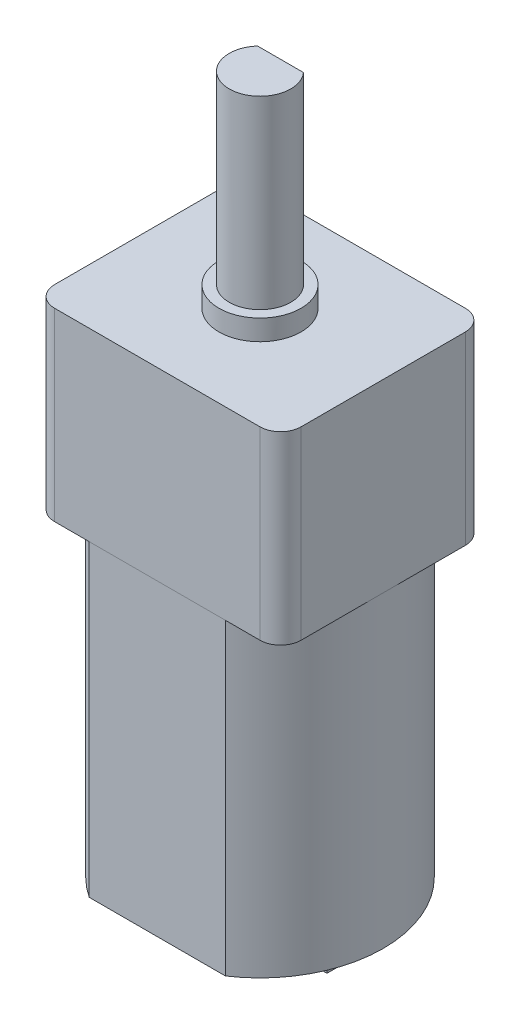
ISO-10303-21;
HEADER;
FILE_DESCRIPTION(('STEP AP214'),'2;1');
FILE_NAME('part.step','',(''),(''),'','','');
FILE_SCHEMA(('AUTOMOTIVE_DESIGN { 1 0 10303 214 1 1 1 1 }'));
ENDSEC;
DATA;
#1=APPLICATION_CONTEXT('core data for automotive mechanical design processes');
#2=APPLICATION_PROTOCOL_DEFINITION('international standard','automotive_design',2000,#1);
#3=PRODUCT_CONTEXT('',#1,'mechanical');
#4=PRODUCT('Part','Part','',(#3));
#5=PRODUCT_RELATED_PRODUCT_CATEGORY('part','',(#4));
#6=PRODUCT_DEFINITION_FORMATION('','',#4);
#7=PRODUCT_DEFINITION_CONTEXT('part definition',#1,'design');
#8=PRODUCT_DEFINITION('design','',#6,#7);
#9=PRODUCT_DEFINITION_SHAPE('','',#8);
#10=(LENGTH_UNIT() NAMED_UNIT(*) SI_UNIT(.MILLI.,.METRE.));
#11=(NAMED_UNIT(*) PLANE_ANGLE_UNIT() SI_UNIT($,.RADIAN.));
#12=(NAMED_UNIT(*) SI_UNIT($,.STERADIAN.) SOLID_ANGLE_UNIT());
#13=UNCERTAINTY_MEASURE_WITH_UNIT(LENGTH_MEASURE(1.E-05),#10,'distance_accuracy_value','');
#14=(GEOMETRIC_REPRESENTATION_CONTEXT(3) GLOBAL_UNCERTAINTY_ASSIGNED_CONTEXT((#13)) GLOBAL_UNIT_ASSIGNED_CONTEXT((#10,
#11,#12)) REPRESENTATION_CONTEXT('',''));
#15=CARTESIAN_POINT('',(0.,0.,0.));
#16=DIRECTION('',(0.,0.,1.));
#17=DIRECTION('',(1.,0.,0.));
#18=AXIS2_PLACEMENT_3D('',#15,#16,#17);
#19=CARTESIAN_POINT('',(0.,25.,0.));
#20=DIRECTION('',(0.,1.,0.));
#21=DIRECTION('',(0.,0.,1.));
#22=AXIS2_PLACEMENT_3D('',#19,#20,#21);
#23=PLANE('',#22);
#24=CARTESIAN_POINT('',(0.,25.,0.));
#25=DIRECTION('',(0.,1.,0.));
#26=DIRECTION('',(0.,0.,1.));
#27=AXIS2_PLACEMENT_3D('',#24,#25,#26);
#28=CIRCLE('',#27,2.);
#29=CARTESIAN_POINT('',(0.,25.,2.));
#30=VERTEX_POINT('',#29);
#31=EDGE_CURVE('E161',#30,#30,#28,.T.);
#32=ORIENTED_EDGE('',*,*,#31,.T.);
#33=EDGE_LOOP('',(#32));
#34=FACE_BOUND('',#33,.T.);
#35=CARTESIAN_POINT('',(0.,25.,0.));
#36=DIRECTION('',(0.,1.,0.));
#37=DIRECTION('',(0.,0.,1.));
#38=AXIS2_PLACEMENT_3D('',#35,#36,#37);
#39=CIRCLE('',#38,1.5);
#40=CARTESIAN_POINT('',(0.,25.,1.5));
#41=VERTEX_POINT('',#40);
#42=EDGE_CURVE('E49',#41,#41,#39,.F.);
#43=ORIENTED_EDGE('',*,*,#42,.T.);
#44=EDGE_LOOP('',(#43));
#45=FACE_BOUND('',#44,.T.);
#46=ADVANCED_FACE('F45',(#34,#45),#23,.T.);
#47=CARTESIAN_POINT('',(-5.,24.,4.));
#48=DIRECTION('',(0.,-1.,0.));
#49=DIRECTION('',(0.,0.,-1.));
#50=AXIS2_PLACEMENT_3D('',#47,#48,#49);
#51=PLANE('',#50);
#52=CARTESIAN_POINT('',(-5.,24.,4.));
#53=DIRECTION('',(0.,1.,0.));
#54=DIRECTION('',(0.,0.,-1.));
#55=AXIS2_PLACEMENT_3D('',#52,#53,#54);
#56=CIRCLE('',#55,1.);
#57=CARTESIAN_POINT('',(-6.,24.,3.99999999999999));
#58=VERTEX_POINT('',#57);
#59=CARTESIAN_POINT('',(-4.99999999999999,24.,5.));
#60=VERTEX_POINT('',#59);
#61=EDGE_CURVE('E173',#58,#60,#56,.T.);
#62=ORIENTED_EDGE('',*,*,#61,.T.);
#63=DIRECTION('',(1.,0.,0.));
#64=VECTOR('',#63,1.);
#65=CARTESIAN_POINT('',(4.99999999999999,24.,5.));
#66=LINE('',#65,#64);
#67=CARTESIAN_POINT('',(4.99999999999999,24.,5.));
#68=VERTEX_POINT('',#67);
#69=EDGE_CURVE('E112',#60,#68,#66,.T.);
#70=ORIENTED_EDGE('',*,*,#69,.T.);
#71=CARTESIAN_POINT('',(5.,24.,4.));
#72=DIRECTION('',(0.,1.,0.));
#73=DIRECTION('',(0.,0.,-1.));
#74=AXIS2_PLACEMENT_3D('',#71,#72,#73);
#75=CIRCLE('',#74,1.);
#76=CARTESIAN_POINT('',(6.,24.,3.99999999999999));
#77=VERTEX_POINT('',#76);
#78=EDGE_CURVE('E205',#68,#77,#75,.T.);
#79=ORIENTED_EDGE('',*,*,#78,.T.);
#80=DIRECTION('',(0.,0.,-1.));
#81=VECTOR('',#80,1.);
#82=CARTESIAN_POINT('',(6.,24.,-3.99999999999999));
#83=LINE('',#82,#81);
#84=CARTESIAN_POINT('',(6.,24.,-3.99999999999999));
#85=VERTEX_POINT('',#84);
#86=EDGE_CURVE('E204',#77,#85,#83,.T.);
#87=ORIENTED_EDGE('',*,*,#86,.T.);
#88=CARTESIAN_POINT('',(5.,24.,-4.));
#89=DIRECTION('',(0.,1.,0.));
#90=DIRECTION('',(0.,0.,-1.));
#91=AXIS2_PLACEMENT_3D('',#88,#89,#90);
#92=CIRCLE('',#91,1.);
#93=CARTESIAN_POINT('',(4.99999999999999,24.,-5.));
#94=VERTEX_POINT('',#93);
#95=EDGE_CURVE('E136',#85,#94,#92,.T.);
#96=ORIENTED_EDGE('',*,*,#95,.T.);
#97=DIRECTION('',(-1.,0.,0.));
#98=VECTOR('',#97,1.);
#99=CARTESIAN_POINT('',(4.99999999999999,24.,-5.));
#100=LINE('',#99,#98);
#101=CARTESIAN_POINT('',(-4.99999999999999,24.,-5.));
#102=VERTEX_POINT('',#101);
#103=EDGE_CURVE('E128',#94,#102,#100,.T.);
#104=ORIENTED_EDGE('',*,*,#103,.T.);
#105=CARTESIAN_POINT('',(-5.,24.,-4.));
#106=DIRECTION('',(0.,1.,0.));
#107=DIRECTION('',(0.,0.,-1.));
#108=AXIS2_PLACEMENT_3D('',#105,#106,#107);
#109=CIRCLE('',#108,1.);
#110=CARTESIAN_POINT('',(-6.,24.,-3.99999999999999));
#111=VERTEX_POINT('',#110);
#112=EDGE_CURVE('E133',#102,#111,#109,.T.);
#113=ORIENTED_EDGE('',*,*,#112,.T.);
#114=DIRECTION('',(0.,0.,1.));
#115=VECTOR('',#114,1.);
#116=CARTESIAN_POINT('',(-6.,24.,-3.99999999999999));
#117=LINE('',#116,#115);
#118=EDGE_CURVE('E70',#111,#58,#117,.T.);
#119=ORIENTED_EDGE('',*,*,#118,.T.);
#120=EDGE_LOOP('',(#62,#70,#79,#87,#96,#104,#113,#119));
#121=FACE_BOUND('',#120,.T.);
#122=CARTESIAN_POINT('',(0.,24.,0.));
#123=DIRECTION('',(0.,-1.,0.));
#124=DIRECTION('',(0.,0.,-1.));
#125=AXIS2_PLACEMENT_3D('',#122,#123,#124);
#126=CIRCLE('',#125,2.);
#127=CARTESIAN_POINT('',(0.,24.,-2.));
#128=VERTEX_POINT('',#127);
#129=EDGE_CURVE('E12',#128,#128,#126,.F.);
#130=ORIENTED_EDGE('',*,*,#129,.F.);
#131=EDGE_LOOP('',(#130));
#132=FACE_BOUND('',#131,.T.);
#133=ADVANCED_FACE('F130',(#121,#132),#51,.F.);
#134=CARTESIAN_POINT('',(-5.,24.,4.));
#135=DIRECTION('',(0.,-1.,0.));
#136=DIRECTION('',(0.,0.,-1.));
#137=AXIS2_PLACEMENT_3D('',#134,#135,#136);
#138=CYLINDRICAL_SURFACE('',#137,1.);
#139=CARTESIAN_POINT('',(-5.,15.,4.));
#140=DIRECTION('',(0.,1.,0.));
#141=DIRECTION('',(0.,0.,-1.));
#142=AXIS2_PLACEMENT_3D('',#139,#140,#141);
#143=CIRCLE('',#142,1.);
#144=CARTESIAN_POINT('',(-6.,15.,3.99999999999999));
#145=VERTEX_POINT('',#144);
#146=CARTESIAN_POINT('',(-4.99999999999999,15.,5.));
#147=VERTEX_POINT('',#146);
#148=EDGE_CURVE('E157',#145,#147,#143,.T.);
#149=ORIENTED_EDGE('',*,*,#148,.T.);
#150=DIRECTION('',(0.,-1.,0.));
#151=VECTOR('',#150,1.);
#152=CARTESIAN_POINT('',(-4.99999999999999,24.,5.));
#153=LINE('',#152,#151);
#154=EDGE_CURVE('E54',#60,#147,#153,.T.);
#155=ORIENTED_EDGE('',*,*,#154,.F.);
#156=ORIENTED_EDGE('',*,*,#61,.F.);
#157=DIRECTION('',(0.,-1.,0.));
#158=VECTOR('',#157,1.);
#159=CARTESIAN_POINT('',(-6.,24.,3.99999999999999));
#160=LINE('',#159,#158);
#161=EDGE_CURVE('E153',#58,#145,#160,.T.);
#162=ORIENTED_EDGE('',*,*,#161,.T.);
#163=EDGE_LOOP('',(#149,#155,#156,#162));
#164=FACE_BOUND('',#163,.T.);
#165=ADVANCED_FACE('F47',(#164),#138,.T.);
#166=CARTESIAN_POINT('',(4.99999999999999,24.,5.));
#167=DIRECTION('',(0.,0.,-1.));
#168=DIRECTION('',(-1.,0.,0.));
#169=AXIS2_PLACEMENT_3D('',#166,#167,#168);
#170=PLANE('',#169);
#171=DIRECTION('',(1.,0.,0.));
#172=VECTOR('',#171,1.);
#173=CARTESIAN_POINT('',(4.99999999999999,15.,5.));
#174=LINE('',#173,#172);
#175=CARTESIAN_POINT('',(4.99999999999999,15.,5.));
#176=VERTEX_POINT('',#175);
#177=EDGE_CURVE('E160',#147,#176,#174,.T.);
#178=ORIENTED_EDGE('',*,*,#177,.T.);
#179=DIRECTION('',(0.,-1.,0.));
#180=VECTOR('',#179,1.);
#181=CARTESIAN_POINT('',(4.99999999999999,24.,5.));
#182=LINE('',#181,#180);
#183=EDGE_CURVE('E183',#68,#176,#182,.T.);
#184=ORIENTED_EDGE('',*,*,#183,.F.);
#185=ORIENTED_EDGE('',*,*,#69,.F.);
#186=ORIENTED_EDGE('',*,*,#154,.T.);
#187=EDGE_LOOP('',(#178,#184,#185,#186));
#188=FACE_BOUND('',#187,.T.);
#189=ADVANCED_FACE('F187',(#188),#170,.F.);
#190=CARTESIAN_POINT('',(5.,24.,4.));
#191=DIRECTION('',(0.,-1.,0.));
#192=DIRECTION('',(0.,0.,-1.));
#193=AXIS2_PLACEMENT_3D('',#190,#191,#192);
#194=CYLINDRICAL_SURFACE('',#193,1.);
#195=CARTESIAN_POINT('',(5.,15.,4.));
#196=DIRECTION('',(0.,1.,0.));
#197=DIRECTION('',(0.,0.,-1.));
#198=AXIS2_PLACEMENT_3D('',#195,#196,#197);
#199=CIRCLE('',#198,1.);
#200=CARTESIAN_POINT('',(6.,15.,3.99999999999999));
#201=VERTEX_POINT('',#200);
#202=EDGE_CURVE('E163',#176,#201,#199,.T.);
#203=ORIENTED_EDGE('',*,*,#202,.T.);
#204=DIRECTION('',(0.,-1.,0.));
#205=VECTOR('',#204,1.);
#206=CARTESIAN_POINT('',(6.,24.,3.99999999999999));
#207=LINE('',#206,#205);
#208=EDGE_CURVE('E180',#77,#201,#207,.T.);
#209=ORIENTED_EDGE('',*,*,#208,.F.);
#210=ORIENTED_EDGE('',*,*,#78,.F.);
#211=ORIENTED_EDGE('',*,*,#183,.T.);
#212=EDGE_LOOP('',(#203,#209,#210,#211));
#213=FACE_BOUND('',#212,.T.);
#214=ADVANCED_FACE('F198',(#213),#194,.T.);
#215=CARTESIAN_POINT('',(6.,24.,-3.99999999999999));
#216=DIRECTION('',(-1.,0.,0.));
#217=DIRECTION('',(0.,0.,1.));
#218=AXIS2_PLACEMENT_3D('',#215,#216,#217);
#219=PLANE('',#218);
#220=DIRECTION('',(0.,0.,-1.));
#221=VECTOR('',#220,1.);
#222=CARTESIAN_POINT('',(6.,15.,-3.99999999999999));
#223=LINE('',#222,#221);
#224=CARTESIAN_POINT('',(6.,15.,-3.99999999999999));
#225=VERTEX_POINT('',#224);
#226=EDGE_CURVE('E165',#201,#225,#223,.T.);
#227=ORIENTED_EDGE('',*,*,#226,.T.);
#228=DIRECTION('',(0.,-1.,0.));
#229=VECTOR('',#228,1.);
#230=CARTESIAN_POINT('',(6.,24.,-3.99999999999999));
#231=LINE('',#230,#229);
#232=EDGE_CURVE('E177',#85,#225,#231,.T.);
#233=ORIENTED_EDGE('',*,*,#232,.F.);
#234=ORIENTED_EDGE('',*,*,#86,.F.);
#235=ORIENTED_EDGE('',*,*,#208,.T.);
#236=EDGE_LOOP('',(#227,#233,#234,#235));
#237=FACE_BOUND('',#236,.T.);
#238=ADVANCED_FACE('F202',(#237),#219,.F.);
#239=CARTESIAN_POINT('',(5.,24.,-4.));
#240=DIRECTION('',(0.,-1.,0.));
#241=DIRECTION('',(0.,0.,-1.));
#242=AXIS2_PLACEMENT_3D('',#239,#240,#241);
#243=CYLINDRICAL_SURFACE('',#242,1.);
#244=CARTESIAN_POINT('',(5.,15.,-4.));
#245=DIRECTION('',(0.,1.,0.));
#246=DIRECTION('',(0.,0.,-1.));
#247=AXIS2_PLACEMENT_3D('',#244,#245,#246);
#248=CIRCLE('',#247,1.);
#249=CARTESIAN_POINT('',(4.99999999999999,15.,-5.));
#250=VERTEX_POINT('',#249);
#251=EDGE_CURVE('E167',#225,#250,#248,.T.);
#252=ORIENTED_EDGE('',*,*,#251,.T.);
#253=DIRECTION('',(0.,-1.,0.));
#254=VECTOR('',#253,1.);
#255=CARTESIAN_POINT('',(4.99999999999999,24.,-5.));
#256=LINE('',#255,#254);
#257=EDGE_CURVE('E148',#94,#250,#256,.T.);
#258=ORIENTED_EDGE('',*,*,#257,.F.);
#259=ORIENTED_EDGE('',*,*,#95,.F.);
#260=ORIENTED_EDGE('',*,*,#232,.T.);
#261=EDGE_LOOP('',(#252,#258,#259,#260));
#262=FACE_BOUND('',#261,.T.);
#263=ADVANCED_FACE('F270',(#262),#243,.T.);
#264=CARTESIAN_POINT('',(4.99999999999999,24.,-5.));
#265=DIRECTION('',(0.,0.,1.));
#266=DIRECTION('',(1.,0.,0.));
#267=AXIS2_PLACEMENT_3D('',#264,#265,#266);
#268=PLANE('',#267);
#269=DIRECTION('',(-1.,0.,0.));
#270=VECTOR('',#269,1.);
#271=CARTESIAN_POINT('',(4.99999999999999,15.,-5.));
#272=LINE('',#271,#270);
#273=CARTESIAN_POINT('',(-4.99999999999999,15.,-5.));
#274=VERTEX_POINT('',#273);
#275=EDGE_CURVE('E145',#250,#274,#272,.T.);
#276=ORIENTED_EDGE('',*,*,#275,.T.);
#277=DIRECTION('',(0.,-1.,0.));
#278=VECTOR('',#277,1.);
#279=CARTESIAN_POINT('',(-4.99999999999999,24.,-5.));
#280=LINE('',#279,#278);
#281=EDGE_CURVE('E142',#102,#274,#280,.T.);
#282=ORIENTED_EDGE('',*,*,#281,.F.);
#283=ORIENTED_EDGE('',*,*,#103,.F.);
#284=ORIENTED_EDGE('',*,*,#257,.T.);
#285=EDGE_LOOP('',(#276,#282,#283,#284));
#286=FACE_BOUND('',#285,.T.);
#287=ADVANCED_FACE('F143',(#286),#268,.F.);
#288=CARTESIAN_POINT('',(-5.,24.,-4.));
#289=DIRECTION('',(0.,-1.,0.));
#290=DIRECTION('',(0.,0.,-1.));
#291=AXIS2_PLACEMENT_3D('',#288,#289,#290);
#292=CYLINDRICAL_SURFACE('',#291,1.);
#293=CARTESIAN_POINT('',(-5.,15.,-4.));
#294=DIRECTION('',(0.,1.,0.));
#295=DIRECTION('',(0.,0.,-1.));
#296=AXIS2_PLACEMENT_3D('',#293,#294,#295);
#297=CIRCLE('',#296,1.);
#298=CARTESIAN_POINT('',(-6.,15.,-3.99999999999999));
#299=VERTEX_POINT('',#298);
#300=EDGE_CURVE('E170',#274,#299,#297,.T.);
#301=ORIENTED_EDGE('',*,*,#300,.T.);
#302=DIRECTION('',(0.,-1.,0.));
#303=VECTOR('',#302,1.);
#304=CARTESIAN_POINT('',(-6.,24.,-3.99999999999999));
#305=LINE('',#304,#303);
#306=EDGE_CURVE('E149',#111,#299,#305,.T.);
#307=ORIENTED_EDGE('',*,*,#306,.F.);
#308=ORIENTED_EDGE('',*,*,#112,.F.);
#309=ORIENTED_EDGE('',*,*,#281,.T.);
#310=EDGE_LOOP('',(#301,#307,#308,#309));
#311=FACE_BOUND('',#310,.T.);
#312=ADVANCED_FACE('F151',(#311),#292,.T.);
#313=CARTESIAN_POINT('',(-6.,24.,-3.99999999999999));
#314=DIRECTION('',(1.,0.,0.));
#315=DIRECTION('',(0.,0.,-1.));
#316=AXIS2_PLACEMENT_3D('',#313,#314,#315);
#317=PLANE('',#316);
#318=DIRECTION('',(0.,0.,1.));
#319=VECTOR('',#318,1.);
#320=CARTESIAN_POINT('',(-6.,15.,-3.99999999999999));
#321=LINE('',#320,#319);
#322=EDGE_CURVE('E103',#299,#145,#321,.T.);
#323=ORIENTED_EDGE('',*,*,#322,.T.);
#324=ORIENTED_EDGE('',*,*,#161,.F.);
#325=ORIENTED_EDGE('',*,*,#118,.F.);
#326=ORIENTED_EDGE('',*,*,#306,.T.);
#327=EDGE_LOOP('',(#323,#324,#325,#326));
#328=FACE_BOUND('',#327,.T.);
#329=ADVANCED_FACE('F263',(#328),#317,.F.);
#330=CARTESIAN_POINT('',(-5.,15.,4.));
#331=DIRECTION('',(0.,-1.,0.));
#332=DIRECTION('',(0.,0.,-1.));
#333=AXIS2_PLACEMENT_3D('',#330,#331,#332);
#334=PLANE('',#333);
#335=ORIENTED_EDGE('',*,*,#148,.F.);
#336=ORIENTED_EDGE('',*,*,#322,.F.);
#337=ORIENTED_EDGE('',*,*,#300,.F.);
#338=ORIENTED_EDGE('',*,*,#275,.F.);
#339=ORIENTED_EDGE('',*,*,#251,.F.);
#340=ORIENTED_EDGE('',*,*,#226,.F.);
#341=ORIENTED_EDGE('',*,*,#202,.F.);
#342=ORIENTED_EDGE('',*,*,#177,.F.);
#343=EDGE_LOOP('',(#335,#336,#337,#338,#339,#340,#341,#342));
#344=FACE_BOUND('',#343,.T.);
#345=ADVANCED_FACE('F192',(#344),#334,.T.);
#346=CARTESIAN_POINT('',(0.,25.,0.));
#347=DIRECTION('',(0.,-1.,0.));
#348=DIRECTION('',(0.,0.,-1.));
#349=AXIS2_PLACEMENT_3D('',#346,#347,#348);
#350=CYLINDRICAL_SURFACE('',#349,2.);
#351=ORIENTED_EDGE('',*,*,#31,.F.);
#352=EDGE_LOOP('',(#351));
#353=FACE_BOUND('',#352,.T.);
#354=ORIENTED_EDGE('',*,*,#129,.T.);
#355=EDGE_LOOP('',(#354));
#356=FACE_BOUND('',#355,.T.);
#357=ADVANCED_FACE('F247',(#353,#356),#350,.T.);
#358=CARTESIAN_POINT('',(0.,34.,0.));
#359=DIRECTION('',(0.,-1.,0.));
#360=DIRECTION('',(0.,0.,-1.));
#361=AXIS2_PLACEMENT_3D('',#358,#359,#360);
#362=CYLINDRICAL_SURFACE('',#361,1.5);
#363=CARTESIAN_POINT('',(0.,34.,0.));
#364=DIRECTION('',(0.,1.,0.));
#365=DIRECTION('',(0.,0.,1.));
#366=AXIS2_PLACEMENT_3D('',#363,#364,#365);
#367=CIRCLE('',#366,1.5);
#368=CARTESIAN_POINT('',(-1.1180339887499,34.,-1.));
#369=VERTEX_POINT('',#368);
#370=CARTESIAN_POINT('',(1.1180339887499,34.,-1.));
#371=VERTEX_POINT('',#370);
#372=EDGE_CURVE('E213',#369,#371,#367,.T.);
#373=ORIENTED_EDGE('',*,*,#372,.F.);
#374=DIRECTION('',(0.,1.,0.));
#375=VECTOR('',#374,1.);
#376=CARTESIAN_POINT('',(-1.1180339887499,25.5,-1.));
#377=LINE('',#376,#375);
#378=CARTESIAN_POINT('',(-1.1180339887499,25.5,-1.));
#379=VERTEX_POINT('',#378);
#380=EDGE_CURVE('E61',#379,#369,#377,.T.);
#381=ORIENTED_EDGE('',*,*,#380,.F.);
#382=CARTESIAN_POINT('',(0.,25.5,0.));
#383=DIRECTION('',(0.,1.,0.));
#384=DIRECTION('',(0.,0.,-1.));
#385=AXIS2_PLACEMENT_3D('',#382,#383,#384);
#386=CIRCLE('',#385,1.5);
#387=CARTESIAN_POINT('',(1.1180339887499,25.5,-1.));
#388=VERTEX_POINT('',#387);
#389=EDGE_CURVE('E223',#388,#379,#386,.T.);
#390=ORIENTED_EDGE('',*,*,#389,.F.);
#391=DIRECTION('',(0.,1.,0.));
#392=VECTOR('',#391,1.);
#393=CARTESIAN_POINT('',(1.1180339887499,25.5,-1.));
#394=LINE('',#393,#392);
#395=EDGE_CURVE('E216',#388,#371,#394,.T.);
#396=ORIENTED_EDGE('',*,*,#395,.T.);
#397=EDGE_LOOP('',(#373,#381,#390,#396));
#398=FACE_BOUND('',#397,.T.);
#399=ORIENTED_EDGE('',*,*,#42,.F.);
#400=EDGE_LOOP('',(#399));
#401=FACE_BOUND('',#400,.T.);
#402=ADVANCED_FACE('F236',(#398,#401),#362,.T.);
#403=CARTESIAN_POINT('',(0.,34.,0.));
#404=DIRECTION('',(0.,1.,0.));
#405=DIRECTION('',(0.,0.,1.));
#406=AXIS2_PLACEMENT_3D('',#403,#404,#405);
#407=PLANE('',#406);
#408=DIRECTION('',(1.,0.,0.));
#409=VECTOR('',#408,1.);
#410=CARTESIAN_POINT('',(-1.1180339887499,34.,-1.));
#411=LINE('',#410,#409);
#412=EDGE_CURVE('E221',#369,#371,#411,.T.);
#413=ORIENTED_EDGE('',*,*,#412,.F.);
#414=ORIENTED_EDGE('',*,*,#372,.T.);
#415=EDGE_LOOP('',(#413,#414));
#416=FACE_BOUND('',#415,.T.);
#417=ADVANCED_FACE('F239',(#416),#407,.T.);
#418=CARTESIAN_POINT('',(-1.1180339887499,25.5,-1.));
#419=DIRECTION('',(0.,0.,1.));
#420=DIRECTION('',(1.,0.,0.));
#421=AXIS2_PLACEMENT_3D('',#418,#419,#420);
#422=PLANE('',#421);
#423=ORIENTED_EDGE('',*,*,#412,.T.);
#424=ORIENTED_EDGE('',*,*,#395,.F.);
#425=DIRECTION('',(1.,0.,0.));
#426=VECTOR('',#425,1.);
#427=CARTESIAN_POINT('',(-1.1180339887499,25.5,-1.));
#428=LINE('',#427,#426);
#429=EDGE_CURVE('E218',#379,#388,#428,.T.);
#430=ORIENTED_EDGE('',*,*,#429,.F.);
#431=ORIENTED_EDGE('',*,*,#380,.T.);
#432=EDGE_LOOP('',(#423,#424,#430,#431));
#433=FACE_BOUND('',#432,.T.);
#434=ADVANCED_FACE('F234',(#433),#422,.F.);
#435=CARTESIAN_POINT('',(0.,25.5,0.));
#436=DIRECTION('',(0.,-1.,0.));
#437=DIRECTION('',(0.,0.,-1.));
#438=AXIS2_PLACEMENT_3D('',#435,#436,#437);
#439=PLANE('',#438);
#440=ORIENTED_EDGE('',*,*,#389,.T.);
#441=ORIENTED_EDGE('',*,*,#429,.T.);
#442=EDGE_LOOP('',(#440,#441));
#443=FACE_BOUND('',#442,.T.);
#444=ADVANCED_FACE('F230',(#443),#439,.F.);
#445=CLOSED_SHELL('',(#46,#133,#165,#189,#214,#238,#263,#287,#312,#329,#345,#357,#402,#417,#434,#444));
#446=MANIFOLD_SOLID_BREP('B2',#445);
#447=CARTESIAN_POINT('',(0.,0.,0.));
#448=DIRECTION('',(0.,1.,0.));
#449=DIRECTION('',(0.,0.,1.));
#450=AXIS2_PLACEMENT_3D('',#447,#448,#449);
#451=PLANE('',#450);
#452=DIRECTION('',(0.,0.,1.));
#453=VECTOR('',#452,1.);
#454=CARTESIAN_POINT('',(-3.98773543561631,0.,0.915406021028156));
#455=LINE('',#454,#453);
#456=CARTESIAN_POINT('',(-3.98773543561631,0.,-0.915406021028156));
#457=VERTEX_POINT('',#456);
#458=CARTESIAN_POINT('',(-3.98773543561631,0.,0.915406021028156));
#459=VERTEX_POINT('',#458);
#460=EDGE_CURVE('E491',#457,#459,#455,.T.);
#461=ORIENTED_EDGE('',*,*,#460,.F.);
#462=DIRECTION('',(1.,0.,0.));
#463=VECTOR('',#462,1.);
#464=CARTESIAN_POINT('',(-4.17698389695304,0.,-0.915406021028156));
#465=LINE('',#464,#463);
#466=CARTESIAN_POINT('',(-4.17698389695304,0.,-0.915406021028156));
#467=VERTEX_POINT('',#466);
#468=EDGE_CURVE('E504',#467,#457,#465,.T.);
#469=ORIENTED_EDGE('',*,*,#468,.F.);
#470=DIRECTION('',(0.,0.,-1.));
#471=VECTOR('',#470,1.);
#472=CARTESIAN_POINT('',(-4.17698389695304,0.,0.915406021028156));
#473=LINE('',#472,#471);
#474=CARTESIAN_POINT('',(-4.17698389695304,0.,0.915406021028156));
#475=VERTEX_POINT('',#474);
#476=EDGE_CURVE('E513',#475,#467,#473,.T.);
#477=ORIENTED_EDGE('',*,*,#476,.F.);
#478=DIRECTION('',(-1.,0.,0.));
#479=VECTOR('',#478,1.);
#480=CARTESIAN_POINT('',(-4.17698389695304,0.,0.915406021028156));
#481=LINE('',#480,#479);
#482=EDGE_CURVE('E494',#459,#475,#481,.T.);
#483=ORIENTED_EDGE('',*,*,#482,.F.);
#484=EDGE_LOOP('',(#461,#469,#477,#483));
#485=FACE_BOUND('',#484,.T.);
#486=CARTESIAN_POINT('',(0.,0.,0.));
#487=DIRECTION('',(0.,1.,0.));
#488=DIRECTION('',(0.,0.,1.));
#489=AXIS2_PLACEMENT_3D('',#486,#487,#488);
#490=CIRCLE('',#489,6.);
#491=CARTESIAN_POINT('',(3.3166247903554,0.,5.));
#492=VERTEX_POINT('',#491);
#493=CARTESIAN_POINT('',(3.3166247903554,0.,-5.));
#494=VERTEX_POINT('',#493);
#495=EDGE_CURVE('E532',#492,#494,#490,.T.);
#496=ORIENTED_EDGE('',*,*,#495,.F.);
#497=DIRECTION('',(1.,0.,0.));
#498=VECTOR('',#497,1.);
#499=CARTESIAN_POINT('',(-3.3166247903554,0.,5.));
#500=LINE('',#499,#498);
#501=CARTESIAN_POINT('',(-3.3166247903554,0.,5.));
#502=VERTEX_POINT('',#501);
#503=EDGE_CURVE('E537',#502,#492,#500,.T.);
#504=ORIENTED_EDGE('',*,*,#503,.F.);
#505=CARTESIAN_POINT('',(0.,0.,0.));
#506=DIRECTION('',(0.,1.,0.));
#507=DIRECTION('',(0.,0.,1.));
#508=AXIS2_PLACEMENT_3D('',#505,#506,#507);
#509=CIRCLE('',#508,6.);
#510=CARTESIAN_POINT('',(-3.3166247903554,0.,-5.));
#511=VERTEX_POINT('',#510);
#512=EDGE_CURVE('E548',#511,#502,#509,.T.);
#513=ORIENTED_EDGE('',*,*,#512,.F.);
#514=DIRECTION('',(-1.,0.,0.));
#515=VECTOR('',#514,1.);
#516=CARTESIAN_POINT('',(-3.3166247903554,0.,-5.));
#517=LINE('',#516,#515);
#518=EDGE_CURVE('E546',#494,#511,#517,.T.);
#519=ORIENTED_EDGE('',*,*,#518,.F.);
#520=EDGE_LOOP('',(#496,#504,#513,#519));
#521=FACE_BOUND('',#520,.T.);
#522=CARTESIAN_POINT('',(0.,0.,0.));
#523=DIRECTION('',(0.,1.,0.));
#524=DIRECTION('',(0.,0.,1.));
#525=AXIS2_PLACEMENT_3D('',#522,#523,#524);
#526=CIRCLE('',#525,2.5);
#527=CARTESIAN_POINT('',(0.,0.,2.5));
#528=VERTEX_POINT('',#527);
#529=EDGE_CURVE('E43',#528,#528,#526,.F.);
#530=ORIENTED_EDGE('',*,*,#529,.F.);
#531=EDGE_LOOP('',(#530));
#532=FACE_BOUND('',#531,.T.);
#533=DIRECTION('',(0.,0.,1.));
#534=VECTOR('',#533,1.);
#535=CARTESIAN_POINT('',(4.17698389695304,0.,0.915406021028156));
#536=LINE('',#535,#534);
#537=CARTESIAN_POINT('',(4.17698389695304,0.,-0.915406021028156));
#538=VERTEX_POINT('',#537);
#539=CARTESIAN_POINT('',(4.17698389695304,0.,0.915406021028156));
#540=VERTEX_POINT('',#539);
#541=EDGE_CURVE('E490',#538,#540,#536,.T.);
#542=ORIENTED_EDGE('',*,*,#541,.F.);
#543=DIRECTION('',(1.,0.,0.));
#544=VECTOR('',#543,1.);
#545=CARTESIAN_POINT('',(4.17698389695304,0.,-0.915406021028156));
#546=LINE('',#545,#544);
#547=CARTESIAN_POINT('',(3.98773543561631,0.,-0.915406021028156));
#548=VERTEX_POINT('',#547);
#549=EDGE_CURVE('E487',#548,#538,#546,.T.);
#550=ORIENTED_EDGE('',*,*,#549,.F.);
#551=DIRECTION('',(0.,0.,-1.));
#552=VECTOR('',#551,1.);
#553=CARTESIAN_POINT('',(3.98773543561631,0.,0.915406021028156));
#554=LINE('',#553,#552);
#555=CARTESIAN_POINT('',(3.98773543561631,0.,0.915406021028156));
#556=VERTEX_POINT('',#555);
#557=EDGE_CURVE('E401',#556,#548,#554,.T.);
#558=ORIENTED_EDGE('',*,*,#557,.F.);
#559=DIRECTION('',(-1.,0.,0.));
#560=VECTOR('',#559,1.);
#561=CARTESIAN_POINT('',(4.17698389695304,0.,0.915406021028156));
#562=LINE('',#561,#560);
#563=EDGE_CURVE('E396',#540,#556,#562,.T.);
#564=ORIENTED_EDGE('',*,*,#563,.F.);
#565=EDGE_LOOP('',(#542,#550,#558,#564));
#566=FACE_BOUND('',#565,.T.);
#567=ADVANCED_FACE('F381',(#485,#521,#532,#566),#451,.F.);
#568=CARTESIAN_POINT('',(0.,15.,0.));
#569=DIRECTION('',(0.,-1.,0.));
#570=DIRECTION('',(0.,0.,-1.));
#571=AXIS2_PLACEMENT_3D('',#568,#569,#570);
#572=CYLINDRICAL_SURFACE('',#571,6.);
#573=ORIENTED_EDGE('',*,*,#495,.T.);
#574=DIRECTION('',(0.,-1.,0.));
#575=VECTOR('',#574,1.);
#576=CARTESIAN_POINT('',(3.3166247903554,15.,-5.));
#577=LINE('',#576,#575);
#578=CARTESIAN_POINT('',(3.3166247903554,15.,-5.));
#579=VERTEX_POINT('',#578);
#580=EDGE_CURVE('E389',#579,#494,#577,.T.);
#581=ORIENTED_EDGE('',*,*,#580,.F.);
#582=CARTESIAN_POINT('',(0.,15.,0.));
#583=DIRECTION('',(0.,1.,0.));
#584=DIRECTION('',(0.,0.,1.));
#585=AXIS2_PLACEMENT_3D('',#582,#583,#584);
#586=CIRCLE('',#585,6.);
#587=CARTESIAN_POINT('',(3.3166247903554,15.,5.));
#588=VERTEX_POINT('',#587);
#589=EDGE_CURVE('E533',#588,#579,#586,.T.);
#590=ORIENTED_EDGE('',*,*,#589,.F.);
#591=DIRECTION('',(0.,-1.,0.));
#592=VECTOR('',#591,1.);
#593=CARTESIAN_POINT('',(3.3166247903554,15.,5.));
#594=LINE('',#593,#592);
#595=EDGE_CURVE('E543',#588,#492,#594,.T.);
#596=ORIENTED_EDGE('',*,*,#595,.T.);
#597=EDGE_LOOP('',(#573,#581,#590,#596));
#598=FACE_BOUND('',#597,.T.);
#599=ADVANCED_FACE('F383',(#598),#572,.T.);
#600=CARTESIAN_POINT('',(-3.3166247903554,15.,-5.));
#601=DIRECTION('',(0.,0.,1.));
#602=DIRECTION('',(1.,0.,0.));
#603=AXIS2_PLACEMENT_3D('',#600,#601,#602);
#604=PLANE('',#603);
#605=ORIENTED_EDGE('',*,*,#518,.T.);
#606=DIRECTION('',(0.,-1.,0.));
#607=VECTOR('',#606,1.);
#608=CARTESIAN_POINT('',(-3.3166247903554,15.,-5.));
#609=LINE('',#608,#607);
#610=CARTESIAN_POINT('',(-3.3166247903554,15.,-5.));
#611=VERTEX_POINT('',#610);
#612=EDGE_CURVE('E556',#611,#511,#609,.T.);
#613=ORIENTED_EDGE('',*,*,#612,.F.);
#614=DIRECTION('',(-1.,0.,0.));
#615=VECTOR('',#614,1.);
#616=CARTESIAN_POINT('',(-3.3166247903554,15.,-5.));
#617=LINE('',#616,#615);
#618=EDGE_CURVE('E536',#579,#611,#617,.T.);
#619=ORIENTED_EDGE('',*,*,#618,.F.);
#620=ORIENTED_EDGE('',*,*,#580,.T.);
#621=EDGE_LOOP('',(#605,#613,#619,#620));
#622=FACE_BOUND('',#621,.T.);
#623=ADVANCED_FACE('F561',(#622),#604,.F.);
#624=CARTESIAN_POINT('',(0.,15.,0.));
#625=DIRECTION('',(0.,-1.,0.));
#626=DIRECTION('',(0.,0.,-1.));
#627=AXIS2_PLACEMENT_3D('',#624,#625,#626);
#628=CYLINDRICAL_SURFACE('',#627,6.);
#629=ORIENTED_EDGE('',*,*,#512,.T.);
#630=DIRECTION('',(0.,-1.,0.));
#631=VECTOR('',#630,1.);
#632=CARTESIAN_POINT('',(-3.3166247903554,15.,5.));
#633=LINE('',#632,#631);
#634=CARTESIAN_POINT('',(-3.3166247903554,15.,5.));
#635=VERTEX_POINT('',#634);
#636=EDGE_CURVE('E553',#635,#502,#633,.T.);
#637=ORIENTED_EDGE('',*,*,#636,.F.);
#638=CARTESIAN_POINT('',(0.,15.,0.));
#639=DIRECTION('',(0.,1.,0.));
#640=DIRECTION('',(0.,0.,1.));
#641=AXIS2_PLACEMENT_3D('',#638,#639,#640);
#642=CIRCLE('',#641,6.);
#643=EDGE_CURVE('E539',#611,#635,#642,.T.);
#644=ORIENTED_EDGE('',*,*,#643,.F.);
#645=ORIENTED_EDGE('',*,*,#612,.T.);
#646=EDGE_LOOP('',(#629,#637,#644,#645));
#647=FACE_BOUND('',#646,.T.);
#648=ADVANCED_FACE('F573',(#647),#628,.T.);
#649=CARTESIAN_POINT('',(-3.3166247903554,15.,5.));
#650=DIRECTION('',(0.,0.,-1.));
#651=DIRECTION('',(-1.,0.,0.));
#652=AXIS2_PLACEMENT_3D('',#649,#650,#651);
#653=PLANE('',#652);
#654=ORIENTED_EDGE('',*,*,#503,.T.);
#655=ORIENTED_EDGE('',*,*,#595,.F.);
#656=DIRECTION('',(1.,0.,0.));
#657=VECTOR('',#656,1.);
#658=CARTESIAN_POINT('',(-3.3166247903554,15.,5.));
#659=LINE('',#658,#657);
#660=EDGE_CURVE('E541',#635,#588,#659,.T.);
#661=ORIENTED_EDGE('',*,*,#660,.F.);
#662=ORIENTED_EDGE('',*,*,#636,.T.);
#663=EDGE_LOOP('',(#654,#655,#661,#662));
#664=FACE_BOUND('',#663,.T.);
#665=ADVANCED_FACE('F577',(#664),#653,.F.);
#666=CARTESIAN_POINT('',(0.,15.,0.));
#667=DIRECTION('',(0.,1.,0.));
#668=DIRECTION('',(0.,0.,1.));
#669=AXIS2_PLACEMENT_3D('',#666,#667,#668);
#670=PLANE('',#669);
#671=ORIENTED_EDGE('',*,*,#589,.T.);
#672=ORIENTED_EDGE('',*,*,#618,.T.);
#673=ORIENTED_EDGE('',*,*,#643,.T.);
#674=ORIENTED_EDGE('',*,*,#660,.T.);
#675=EDGE_LOOP('',(#671,#672,#673,#674));
#676=FACE_BOUND('',#675,.T.);
#677=ADVANCED_FACE('F579',(#676),#670,.T.);
#678=CARTESIAN_POINT('',(0.,-1.5,0.));
#679=DIRECTION('',(0.,1.,0.));
#680=DIRECTION('',(0.,0.,1.));
#681=AXIS2_PLACEMENT_3D('',#678,#679,#680);
#682=CYLINDRICAL_SURFACE('',#681,2.5);
#683=CARTESIAN_POINT('',(0.,-1.5,0.));
#684=DIRECTION('',(0.,-1.,0.));
#685=DIRECTION('',(0.,0.,-1.));
#686=AXIS2_PLACEMENT_3D('',#683,#684,#685);
#687=CIRCLE('',#686,2.5);
#688=CARTESIAN_POINT('',(0.,-1.5,-2.5));
#689=VERTEX_POINT('',#688);
#690=EDGE_CURVE('E529',#689,#689,#687,.T.);
#691=ORIENTED_EDGE('',*,*,#690,.F.);
#692=EDGE_LOOP('',(#691));
#693=FACE_BOUND('',#692,.T.);
#694=ORIENTED_EDGE('',*,*,#529,.T.);
#695=EDGE_LOOP('',(#694));
#696=FACE_BOUND('',#695,.T.);
#697=ADVANCED_FACE('F581',(#693,#696),#682,.T.);
#698=CARTESIAN_POINT('',(0.,-1.5,0.));
#699=DIRECTION('',(0.,-1.,0.));
#700=DIRECTION('',(0.,0.,-1.));
#701=AXIS2_PLACEMENT_3D('',#698,#699,#700);
#702=PLANE('',#701);
#703=ORIENTED_EDGE('',*,*,#690,.T.);
#704=EDGE_LOOP('',(#703));
#705=FACE_BOUND('',#704,.T.);
#706=ADVANCED_FACE('F587',(#705),#702,.T.);
#707=CARTESIAN_POINT('',(-3.98773543561631,-1.5,0.915406021028156));
#708=DIRECTION('',(-1.,0.,0.));
#709=DIRECTION('',(0.,0.,1.));
#710=AXIS2_PLACEMENT_3D('',#707,#708,#709);
#711=PLANE('',#710);
#712=ORIENTED_EDGE('',*,*,#460,.T.);
#713=DIRECTION('',(0.,1.,0.));
#714=VECTOR('',#713,1.);
#715=CARTESIAN_POINT('',(-3.98773543561631,-1.5,0.915406021028156));
#716=LINE('',#715,#714);
#717=CARTESIAN_POINT('',(-3.98773543561631,-1.5,0.915406021028156));
#718=VERTEX_POINT('',#717);
#719=EDGE_CURVE('E526',#718,#459,#716,.T.);
#720=ORIENTED_EDGE('',*,*,#719,.F.);
#721=DIRECTION('',(0.,0.,1.));
#722=VECTOR('',#721,1.);
#723=CARTESIAN_POINT('',(-3.98773543561631,-1.5,0.915406021028156));
#724=LINE('',#723,#722);
#725=CARTESIAN_POINT('',(-3.98773543561631,-1.5,-0.915406021028156));
#726=VERTEX_POINT('',#725);
#727=EDGE_CURVE('E500',#726,#718,#724,.T.);
#728=ORIENTED_EDGE('',*,*,#727,.F.);
#729=DIRECTION('',(0.,1.,0.));
#730=VECTOR('',#729,1.);
#731=CARTESIAN_POINT('',(-3.98773543561631,-1.5,-0.915406021028156));
#732=LINE('',#731,#730);
#733=EDGE_CURVE('E509',#726,#457,#732,.T.);
#734=ORIENTED_EDGE('',*,*,#733,.T.);
#735=EDGE_LOOP('',(#712,#720,#728,#734));
#736=FACE_BOUND('',#735,.T.);
#737=ADVANCED_FACE('F639',(#736),#711,.F.);
#738=CARTESIAN_POINT('',(-4.17698389695304,-1.5,0.915406021028156));
#739=DIRECTION('',(0.,0.,-1.));
#740=DIRECTION('',(-1.,0.,0.));
#741=AXIS2_PLACEMENT_3D('',#738,#739,#740);
#742=PLANE('',#741);
#743=ORIENTED_EDGE('',*,*,#482,.T.);
#744=DIRECTION('',(0.,1.,0.));
#745=VECTOR('',#744,1.);
#746=CARTESIAN_POINT('',(-4.17698389695304,-1.5,0.915406021028156));
#747=LINE('',#746,#745);
#748=CARTESIAN_POINT('',(-4.17698389695304,-1.5,0.915406021028156));
#749=VERTEX_POINT('',#748);
#750=EDGE_CURVE('E523',#749,#475,#747,.T.);
#751=ORIENTED_EDGE('',*,*,#750,.F.);
#752=DIRECTION('',(-1.,0.,0.));
#753=VECTOR('',#752,1.);
#754=CARTESIAN_POINT('',(-4.17698389695304,-1.5,0.915406021028156));
#755=LINE('',#754,#753);
#756=EDGE_CURVE('E503',#718,#749,#755,.T.);
#757=ORIENTED_EDGE('',*,*,#756,.F.);
#758=ORIENTED_EDGE('',*,*,#719,.T.);
#759=EDGE_LOOP('',(#743,#751,#757,#758));
#760=FACE_BOUND('',#759,.T.);
#761=ADVANCED_FACE('F649',(#760),#742,.F.);
#762=CARTESIAN_POINT('',(-4.17698389695304,-1.5,0.915406021028156));
#763=DIRECTION('',(1.,0.,0.));
#764=DIRECTION('',(0.,0.,-1.));
#765=AXIS2_PLACEMENT_3D('',#762,#763,#764);
#766=PLANE('',#765);
#767=ORIENTED_EDGE('',*,*,#476,.T.);
#768=DIRECTION('',(0.,1.,0.));
#769=VECTOR('',#768,1.);
#770=CARTESIAN_POINT('',(-4.17698389695304,-1.5,-0.915406021028156));
#771=LINE('',#770,#769);
#772=CARTESIAN_POINT('',(-4.17698389695304,-1.5,-0.915406021028156));
#773=VERTEX_POINT('',#772);
#774=EDGE_CURVE('E520',#773,#467,#771,.T.);
#775=ORIENTED_EDGE('',*,*,#774,.F.);
#776=DIRECTION('',(0.,0.,-1.));
#777=VECTOR('',#776,1.);
#778=CARTESIAN_POINT('',(-4.17698389695304,-1.5,0.915406021028156));
#779=LINE('',#778,#777);
#780=EDGE_CURVE('E506',#749,#773,#779,.T.);
#781=ORIENTED_EDGE('',*,*,#780,.F.);
#782=ORIENTED_EDGE('',*,*,#750,.T.);
#783=EDGE_LOOP('',(#767,#775,#781,#782));
#784=FACE_BOUND('',#783,.T.);
#785=ADVANCED_FACE('F659',(#784),#766,.F.);
#786=CARTESIAN_POINT('',(-4.17698389695304,-1.5,-0.915406021028156));
#787=DIRECTION('',(0.,0.,1.));
#788=DIRECTION('',(1.,0.,0.));
#789=AXIS2_PLACEMENT_3D('',#786,#787,#788);
#790=PLANE('',#789);
#791=ORIENTED_EDGE('',*,*,#468,.T.);
#792=ORIENTED_EDGE('',*,*,#733,.F.);
#793=DIRECTION('',(1.,0.,0.));
#794=VECTOR('',#793,1.);
#795=CARTESIAN_POINT('',(-4.17698389695304,-1.5,-0.915406021028156));
#796=LINE('',#795,#794);
#797=EDGE_CURVE('E508',#773,#726,#796,.T.);
#798=ORIENTED_EDGE('',*,*,#797,.F.);
#799=ORIENTED_EDGE('',*,*,#774,.T.);
#800=EDGE_LOOP('',(#791,#792,#798,#799));
#801=FACE_BOUND('',#800,.T.);
#802=ADVANCED_FACE('F669',(#801),#790,.F.);
#803=CARTESIAN_POINT('',(0.,-1.5,0.));
#804=DIRECTION('',(0.,-1.,0.));
#805=DIRECTION('',(0.,0.,-1.));
#806=AXIS2_PLACEMENT_3D('',#803,#804,#805);
#807=PLANE('',#806);
#808=ORIENTED_EDGE('',*,*,#727,.T.);
#809=ORIENTED_EDGE('',*,*,#756,.T.);
#810=ORIENTED_EDGE('',*,*,#780,.T.);
#811=ORIENTED_EDGE('',*,*,#797,.T.);
#812=EDGE_LOOP('',(#808,#809,#810,#811));
#813=FACE_BOUND('',#812,.T.);
#814=ADVANCED_FACE('F679',(#813),#807,.T.);
#815=CARTESIAN_POINT('',(4.17698389695304,-1.5,0.915406021028156));
#816=DIRECTION('',(-1.,0.,0.));
#817=DIRECTION('',(0.,0.,1.));
#818=AXIS2_PLACEMENT_3D('',#815,#816,#817);
#819=PLANE('',#818);
#820=ORIENTED_EDGE('',*,*,#541,.T.);
#821=DIRECTION('',(0.,1.,0.));
#822=VECTOR('',#821,1.);
#823=CARTESIAN_POINT('',(4.17698389695304,-1.5,0.915406021028156));
#824=LINE('',#823,#822);
#825=CARTESIAN_POINT('',(4.17698389695304,-1.5,0.915406021028156));
#826=VERTEX_POINT('',#825);
#827=EDGE_CURVE('E471',#826,#540,#824,.T.);
#828=ORIENTED_EDGE('',*,*,#827,.F.);
#829=DIRECTION('',(0.,0.,1.));
#830=VECTOR('',#829,1.);
#831=CARTESIAN_POINT('',(4.17698389695304,-1.5,0.915406021028156));
#832=LINE('',#831,#830);
#833=CARTESIAN_POINT('',(4.17698389695304,-1.5,-0.915406021028156));
#834=VERTEX_POINT('',#833);
#835=EDGE_CURVE('E478',#834,#826,#832,.T.);
#836=ORIENTED_EDGE('',*,*,#835,.F.);
#837=DIRECTION('',(0.,1.,0.));
#838=VECTOR('',#837,1.);
#839=CARTESIAN_POINT('',(4.17698389695304,-1.5,-0.915406021028156));
#840=LINE('',#839,#838);
#841=EDGE_CURVE('E739',#834,#538,#840,.T.);
#842=ORIENTED_EDGE('',*,*,#841,.T.);
#843=EDGE_LOOP('',(#820,#828,#836,#842));
#844=FACE_BOUND('',#843,.T.);
#845=ADVANCED_FACE('F489',(#844),#819,.F.);
#846=CARTESIAN_POINT('',(4.17698389695304,-1.5,0.915406021028156));
#847=DIRECTION('',(0.,0.,-1.));
#848=DIRECTION('',(-1.,0.,0.));
#849=AXIS2_PLACEMENT_3D('',#846,#847,#848);
#850=PLANE('',#849);
#851=ORIENTED_EDGE('',*,*,#563,.T.);
#852=DIRECTION('',(0.,1.,0.));
#853=VECTOR('',#852,1.);
#854=CARTESIAN_POINT('',(3.98773543561631,-1.5,0.915406021028156));
#855=LINE('',#854,#853);
#856=CARTESIAN_POINT('',(3.98773543561631,-1.5,0.915406021028156));
#857=VERTEX_POINT('',#856);
#858=EDGE_CURVE('E474',#857,#556,#855,.T.);
#859=ORIENTED_EDGE('',*,*,#858,.F.);
#860=DIRECTION('',(-1.,0.,0.));
#861=VECTOR('',#860,1.);
#862=CARTESIAN_POINT('',(4.17698389695304,-1.5,0.915406021028156));
#863=LINE('',#862,#861);
#864=EDGE_CURVE('E467',#826,#857,#863,.T.);
#865=ORIENTED_EDGE('',*,*,#864,.F.);
#866=ORIENTED_EDGE('',*,*,#827,.T.);
#867=EDGE_LOOP('',(#851,#859,#865,#866));
#868=FACE_BOUND('',#867,.T.);
#869=ADVANCED_FACE('F469',(#868),#850,.F.);
#870=CARTESIAN_POINT('',(3.98773543561631,-1.5,0.915406021028156));
#871=DIRECTION('',(1.,0.,0.));
#872=DIRECTION('',(0.,0.,-1.));
#873=AXIS2_PLACEMENT_3D('',#870,#871,#872);
#874=PLANE('',#873);
#875=ORIENTED_EDGE('',*,*,#557,.T.);
#876=DIRECTION('',(0.,1.,0.));
#877=VECTOR('',#876,1.);
#878=CARTESIAN_POINT('',(3.98773543561631,-1.5,-0.915406021028156));
#879=LINE('',#878,#877);
#880=CARTESIAN_POINT('',(3.98773543561631,-1.5,-0.915406021028156));
#881=VERTEX_POINT('',#880);
#882=EDGE_CURVE('E496',#881,#548,#879,.T.);
#883=ORIENTED_EDGE('',*,*,#882,.F.);
#884=DIRECTION('',(0.,0.,-1.));
#885=VECTOR('',#884,1.);
#886=CARTESIAN_POINT('',(3.98773543561631,-1.5,0.915406021028156));
#887=LINE('',#886,#885);
#888=EDGE_CURVE('E477',#857,#881,#887,.T.);
#889=ORIENTED_EDGE('',*,*,#888,.F.);
#890=ORIENTED_EDGE('',*,*,#858,.T.);
#891=EDGE_LOOP('',(#875,#883,#889,#890));
#892=FACE_BOUND('',#891,.T.);
#893=ADVANCED_FACE('F706',(#892),#874,.F.);
#894=CARTESIAN_POINT('',(4.17698389695304,-1.5,-0.915406021028156));
#895=DIRECTION('',(0.,0.,1.));
#896=DIRECTION('',(1.,0.,0.));
#897=AXIS2_PLACEMENT_3D('',#894,#895,#896);
#898=PLANE('',#897);
#899=ORIENTED_EDGE('',*,*,#549,.T.);
#900=ORIENTED_EDGE('',*,*,#841,.F.);
#901=DIRECTION('',(1.,0.,0.));
#902=VECTOR('',#901,1.);
#903=CARTESIAN_POINT('',(4.17698389695304,-1.5,-0.915406021028156));
#904=LINE('',#903,#902);
#905=EDGE_CURVE('E483',#881,#834,#904,.T.);
#906=ORIENTED_EDGE('',*,*,#905,.F.);
#907=ORIENTED_EDGE('',*,*,#882,.T.);
#908=EDGE_LOOP('',(#899,#900,#906,#907));
#909=FACE_BOUND('',#908,.T.);
#910=ADVANCED_FACE('F715',(#909),#898,.F.);
#911=CARTESIAN_POINT('',(0.,-1.5,0.));
#912=DIRECTION('',(0.,1.,0.));
#913=DIRECTION('',(0.,0.,1.));
#914=AXIS2_PLACEMENT_3D('',#911,#912,#913);
#915=PLANE('',#914);
#916=ORIENTED_EDGE('',*,*,#835,.T.);
#917=ORIENTED_EDGE('',*,*,#864,.T.);
#918=ORIENTED_EDGE('',*,*,#888,.T.);
#919=ORIENTED_EDGE('',*,*,#905,.T.);
#920=EDGE_LOOP('',(#916,#917,#918,#919));
#921=FACE_BOUND('',#920,.T.);
#922=ADVANCED_FACE('F481',(#921),#915,.F.);
#923=CLOSED_SHELL('',(#567,#599,#623,#648,#665,#677,#697,#706,#737,#761,#785,#802,#814,#845,
#869,#893,#910,#922));
#924=MANIFOLD_SOLID_BREP('B6',#923);
#925=ADVANCED_BREP_SHAPE_REPRESENTATION('',(#18,#446,#924),#14);
#926=SHAPE_DEFINITION_REPRESENTATION(#9,#925);
ENDSEC;
END-ISO-10303-21;
